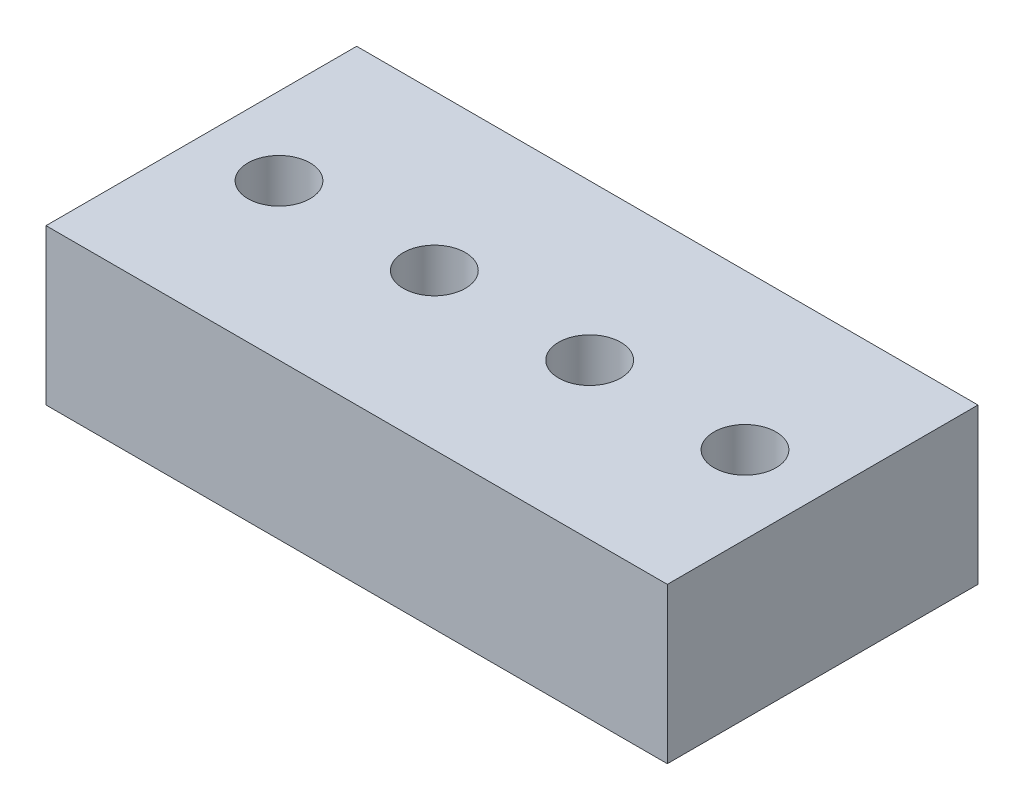
ISO-10303-21;
HEADER;
FILE_DESCRIPTION(('STEP AP214'),'2;1');
FILE_NAME('part.step','',(''),(''),'','','');
FILE_SCHEMA(('AUTOMOTIVE_DESIGN { 1 0 10303 214 1 1 1 1 }'));
ENDSEC;
DATA;
#1=APPLICATION_CONTEXT('core data for automotive mechanical design processes');
#2=APPLICATION_PROTOCOL_DEFINITION('international standard','automotive_design',2000,#1);
#3=PRODUCT_CONTEXT('',#1,'mechanical');
#4=PRODUCT('Part','Part','',(#3));
#5=PRODUCT_RELATED_PRODUCT_CATEGORY('part','',(#4));
#6=PRODUCT_DEFINITION_FORMATION('','',#4);
#7=PRODUCT_DEFINITION_CONTEXT('part definition',#1,'design');
#8=PRODUCT_DEFINITION('design','',#6,#7);
#9=PRODUCT_DEFINITION_SHAPE('','',#8);
#10=(LENGTH_UNIT() NAMED_UNIT(*) SI_UNIT(.MILLI.,.METRE.));
#11=(NAMED_UNIT(*) PLANE_ANGLE_UNIT() SI_UNIT($,.RADIAN.));
#12=(NAMED_UNIT(*) SI_UNIT($,.STERADIAN.) SOLID_ANGLE_UNIT());
#13=UNCERTAINTY_MEASURE_WITH_UNIT(LENGTH_MEASURE(1.E-05),#10,'distance_accuracy_value','');
#14=(GEOMETRIC_REPRESENTATION_CONTEXT(3) GLOBAL_UNCERTAINTY_ASSIGNED_CONTEXT((#13)) GLOBAL_UNIT_ASSIGNED_CONTEXT((#10,
#11,#12)) REPRESENTATION_CONTEXT('',''));
#15=CARTESIAN_POINT('',(0.,0.,0.));
#16=DIRECTION('',(0.,0.,1.));
#17=DIRECTION('',(1.,0.,0.));
#18=AXIS2_PLACEMENT_3D('',#15,#16,#17);
#19=CARTESIAN_POINT('',(30.,0.,0.));
#20=DIRECTION('',(0.,1.,0.));
#21=DIRECTION('',(0.,0.,1.));
#22=AXIS2_PLACEMENT_3D('',#19,#20,#21);
#23=CYLINDRICAL_SURFACE('',#22,3.99999999999999);
#24=CARTESIAN_POINT('',(30.,0.,0.));
#25=DIRECTION('',(0.,1.,0.));
#26=DIRECTION('',(0.,0.,1.));
#27=AXIS2_PLACEMENT_3D('',#24,#25,#26);
#28=CIRCLE('',#27,3.99999999999999);
#29=CARTESIAN_POINT('',(30.,0.,3.99999999999999));
#30=VERTEX_POINT('',#29);
#31=EDGE_CURVE('E49',#30,#30,#28,.T.);
#32=ORIENTED_EDGE('',*,*,#31,.F.);
#33=EDGE_LOOP('',(#32));
#34=FACE_BOUND('',#33,.T.);
#35=CARTESIAN_POINT('',(30.,20.,0.));
#36=DIRECTION('',(0.,1.,0.));
#37=DIRECTION('',(0.,0.,1.));
#38=AXIS2_PLACEMENT_3D('',#35,#36,#37);
#39=CIRCLE('',#38,3.99999999999999);
#40=CARTESIAN_POINT('',(30.,20.,3.99999999999999));
#41=VERTEX_POINT('',#40);
#42=EDGE_CURVE('E11',#41,#41,#39,.T.);
#43=ORIENTED_EDGE('',*,*,#42,.T.);
#44=EDGE_LOOP('',(#43));
#45=FACE_BOUND('',#44,.T.);
#46=ADVANCED_FACE('F41',(#34,#45),#23,.F.);
#47=CARTESIAN_POINT('',(10.,0.,0.));
#48=DIRECTION('',(0.,1.,0.));
#49=DIRECTION('',(0.,0.,1.));
#50=AXIS2_PLACEMENT_3D('',#47,#48,#49);
#51=CYLINDRICAL_SURFACE('',#50,3.99999999999999);
#52=CARTESIAN_POINT('',(10.,0.,0.));
#53=DIRECTION('',(0.,1.,0.));
#54=DIRECTION('',(0.,0.,1.));
#55=AXIS2_PLACEMENT_3D('',#52,#53,#54);
#56=CIRCLE('',#55,3.99999999999999);
#57=CARTESIAN_POINT('',(10.,0.,3.99999999999999));
#58=VERTEX_POINT('',#57);
#59=EDGE_CURVE('E119',#58,#58,#56,.T.);
#60=ORIENTED_EDGE('',*,*,#59,.F.);
#61=EDGE_LOOP('',(#60));
#62=FACE_BOUND('',#61,.T.);
#63=CARTESIAN_POINT('',(10.,20.,0.));
#64=DIRECTION('',(0.,1.,0.));
#65=DIRECTION('',(0.,0.,1.));
#66=AXIS2_PLACEMENT_3D('',#63,#64,#65);
#67=CIRCLE('',#66,3.99999999999999);
#68=CARTESIAN_POINT('',(10.,20.,3.99999999999999));
#69=VERTEX_POINT('',#68);
#70=EDGE_CURVE('E122',#69,#69,#67,.T.);
#71=ORIENTED_EDGE('',*,*,#70,.T.);
#72=EDGE_LOOP('',(#71));
#73=FACE_BOUND('',#72,.T.);
#74=ADVANCED_FACE('F131',(#62,#73),#51,.F.);
#75=CARTESIAN_POINT('',(-40.,20.,-20.));
#76=DIRECTION('',(1.,0.,0.));
#77=DIRECTION('',(0.,0.,-1.));
#78=AXIS2_PLACEMENT_3D('',#75,#76,#77);
#79=PLANE('',#78);
#80=DIRECTION('',(0.,0.,1.));
#81=VECTOR('',#80,1.);
#82=CARTESIAN_POINT('',(-40.,0.,-20.));
#83=LINE('',#82,#81);
#84=CARTESIAN_POINT('',(-40.,0.,-20.));
#85=VERTEX_POINT('',#84);
#86=CARTESIAN_POINT('',(-40.,0.,20.));
#87=VERTEX_POINT('',#86);
#88=EDGE_CURVE('E109',#85,#87,#83,.T.);
#89=ORIENTED_EDGE('',*,*,#88,.T.);
#90=DIRECTION('',(0.,-1.,0.));
#91=VECTOR('',#90,1.);
#92=CARTESIAN_POINT('',(-40.,20.,20.));
#93=LINE('',#92,#91);
#94=CARTESIAN_POINT('',(-40.,20.,20.));
#95=VERTEX_POINT('',#94);
#96=EDGE_CURVE('E100',#95,#87,#93,.T.);
#97=ORIENTED_EDGE('',*,*,#96,.F.);
#98=DIRECTION('',(0.,0.,1.));
#99=VECTOR('',#98,1.);
#100=CARTESIAN_POINT('',(-40.,20.,-20.));
#101=LINE('',#100,#99);
#102=CARTESIAN_POINT('',(-40.,20.,-20.));
#103=VERTEX_POINT('',#102);
#104=EDGE_CURVE('E94',#103,#95,#101,.T.);
#105=ORIENTED_EDGE('',*,*,#104,.F.);
#106=DIRECTION('',(0.,-1.,0.));
#107=VECTOR('',#106,1.);
#108=CARTESIAN_POINT('',(-40.,20.,-20.));
#109=LINE('',#108,#107);
#110=EDGE_CURVE('E105',#103,#85,#109,.T.);
#111=ORIENTED_EDGE('',*,*,#110,.T.);
#112=EDGE_LOOP('',(#89,#97,#105,#111));
#113=FACE_BOUND('',#112,.T.);
#114=ADVANCED_FACE('F156',(#113),#79,.F.);
#115=CARTESIAN_POINT('',(-40.,20.,20.));
#116=DIRECTION('',(0.,0.,-1.));
#117=DIRECTION('',(-1.,0.,0.));
#118=AXIS2_PLACEMENT_3D('',#115,#116,#117);
#119=PLANE('',#118);
#120=DIRECTION('',(1.,0.,0.));
#121=VECTOR('',#120,1.);
#122=CARTESIAN_POINT('',(-40.,0.,20.));
#123=LINE('',#122,#121);
#124=CARTESIAN_POINT('',(40.,0.,20.));
#125=VERTEX_POINT('',#124);
#126=EDGE_CURVE('E99',#87,#125,#123,.T.);
#127=ORIENTED_EDGE('',*,*,#126,.T.);
#128=DIRECTION('',(0.,-1.,0.));
#129=VECTOR('',#128,1.);
#130=CARTESIAN_POINT('',(40.,20.,20.));
#131=LINE('',#130,#129);
#132=CARTESIAN_POINT('',(40.,20.,20.));
#133=VERTEX_POINT('',#132);
#134=EDGE_CURVE('E97',#133,#125,#131,.T.);
#135=ORIENTED_EDGE('',*,*,#134,.F.);
#136=DIRECTION('',(1.,0.,0.));
#137=VECTOR('',#136,1.);
#138=CARTESIAN_POINT('',(-40.,20.,20.));
#139=LINE('',#138,#137);
#140=EDGE_CURVE('E88',#95,#133,#139,.T.);
#141=ORIENTED_EDGE('',*,*,#140,.F.);
#142=ORIENTED_EDGE('',*,*,#96,.T.);
#143=EDGE_LOOP('',(#127,#135,#141,#142));
#144=FACE_BOUND('',#143,.T.);
#145=ADVANCED_FACE('F98',(#144),#119,.F.);
#146=CARTESIAN_POINT('',(40.,20.,20.));
#147=DIRECTION('',(-1.,0.,0.));
#148=DIRECTION('',(0.,0.,1.));
#149=AXIS2_PLACEMENT_3D('',#146,#147,#148);
#150=PLANE('',#149);
#151=DIRECTION('',(0.,0.,-1.));
#152=VECTOR('',#151,1.);
#153=CARTESIAN_POINT('',(40.,0.,20.));
#154=LINE('',#153,#152);
#155=CARTESIAN_POINT('',(40.,0.,-20.));
#156=VERTEX_POINT('',#155);
#157=EDGE_CURVE('E74',#125,#156,#154,.T.);
#158=ORIENTED_EDGE('',*,*,#157,.T.);
#159=DIRECTION('',(0.,-1.,0.));
#160=VECTOR('',#159,1.);
#161=CARTESIAN_POINT('',(40.,20.,-20.));
#162=LINE('',#161,#160);
#163=CARTESIAN_POINT('',(40.,20.,-20.));
#164=VERTEX_POINT('',#163);
#165=EDGE_CURVE('E101',#164,#156,#162,.T.);
#166=ORIENTED_EDGE('',*,*,#165,.F.);
#167=DIRECTION('',(0.,0.,-1.));
#168=VECTOR('',#167,1.);
#169=CARTESIAN_POINT('',(40.,20.,20.));
#170=LINE('',#169,#168);
#171=EDGE_CURVE('E92',#133,#164,#170,.T.);
#172=ORIENTED_EDGE('',*,*,#171,.F.);
#173=ORIENTED_EDGE('',*,*,#134,.T.);
#174=EDGE_LOOP('',(#158,#166,#172,#173));
#175=FACE_BOUND('',#174,.T.);
#176=ADVANCED_FACE('F103',(#175),#150,.F.);
#177=CARTESIAN_POINT('',(40.,20.,-20.));
#178=DIRECTION('',(0.,0.,1.));
#179=DIRECTION('',(1.,0.,0.));
#180=AXIS2_PLACEMENT_3D('',#177,#178,#179);
#181=PLANE('',#180);
#182=DIRECTION('',(-1.,0.,0.));
#183=VECTOR('',#182,1.);
#184=CARTESIAN_POINT('',(40.,0.,-20.));
#185=LINE('',#184,#183);
#186=EDGE_CURVE('E80',#156,#85,#185,.T.);
#187=ORIENTED_EDGE('',*,*,#186,.T.);
#188=ORIENTED_EDGE('',*,*,#110,.F.);
#189=DIRECTION('',(-1.,0.,0.));
#190=VECTOR('',#189,1.);
#191=CARTESIAN_POINT('',(40.,20.,-20.));
#192=LINE('',#191,#190);
#193=EDGE_CURVE('E57',#164,#103,#192,.T.);
#194=ORIENTED_EDGE('',*,*,#193,.F.);
#195=ORIENTED_EDGE('',*,*,#165,.T.);
#196=EDGE_LOOP('',(#187,#188,#194,#195));
#197=FACE_BOUND('',#196,.T.);
#198=ADVANCED_FACE('F135',(#197),#181,.F.);
#199=CARTESIAN_POINT('',(0.,20.,0.));
#200=DIRECTION('',(0.,1.,0.));
#201=DIRECTION('',(0.,0.,1.));
#202=AXIS2_PLACEMENT_3D('',#199,#200,#201);
#203=PLANE('',#202);
#204=CARTESIAN_POINT('',(-10.,20.,0.));
#205=DIRECTION('',(0.,1.,0.));
#206=DIRECTION('',(0.,0.,1.));
#207=AXIS2_PLACEMENT_3D('',#204,#205,#206);
#208=CIRCLE('',#207,3.99999999999999);
#209=CARTESIAN_POINT('',(-10.,20.,3.99999999999999));
#210=VERTEX_POINT('',#209);
#211=EDGE_CURVE('E232',#210,#210,#208,.T.);
#212=ORIENTED_EDGE('',*,*,#211,.F.);
#213=EDGE_LOOP('',(#212));
#214=FACE_BOUND('',#213,.T.);
#215=CARTESIAN_POINT('',(-30.,20.,0.));
#216=DIRECTION('',(0.,1.,0.));
#217=DIRECTION('',(0.,0.,1.));
#218=AXIS2_PLACEMENT_3D('',#215,#216,#217);
#219=CIRCLE('',#218,3.99999999999999);
#220=CARTESIAN_POINT('',(-30.,20.,3.99999999999999));
#221=VERTEX_POINT('',#220);
#222=EDGE_CURVE('E233',#221,#221,#219,.T.);
#223=ORIENTED_EDGE('',*,*,#222,.F.);
#224=EDGE_LOOP('',(#223));
#225=FACE_BOUND('',#224,.T.);
#226=ORIENTED_EDGE('',*,*,#104,.T.);
#227=ORIENTED_EDGE('',*,*,#140,.T.);
#228=ORIENTED_EDGE('',*,*,#171,.T.);
#229=ORIENTED_EDGE('',*,*,#193,.T.);
#230=EDGE_LOOP('',(#226,#227,#228,#229));
#231=FACE_BOUND('',#230,.T.);
#232=ORIENTED_EDGE('',*,*,#70,.F.);
#233=EDGE_LOOP('',(#232));
#234=FACE_BOUND('',#233,.T.);
#235=ORIENTED_EDGE('',*,*,#42,.F.);
#236=EDGE_LOOP('',(#235));
#237=FACE_BOUND('',#236,.T.);
#238=ADVANCED_FACE('F89',(#214,#225,#231,#234,#237),#203,.T.);
#239=CARTESIAN_POINT('',(0.,0.,0.));
#240=DIRECTION('',(0.,1.,0.));
#241=DIRECTION('',(0.,0.,1.));
#242=AXIS2_PLACEMENT_3D('',#239,#240,#241);
#243=PLANE('',#242);
#244=CARTESIAN_POINT('',(-10.,0.,0.));
#245=DIRECTION('',(0.,1.,0.));
#246=DIRECTION('',(0.,0.,1.));
#247=AXIS2_PLACEMENT_3D('',#244,#245,#246);
#248=CIRCLE('',#247,3.99999999999999);
#249=CARTESIAN_POINT('',(-10.,0.,3.99999999999999));
#250=VERTEX_POINT('',#249);
#251=EDGE_CURVE('E230',#250,#250,#248,.T.);
#252=ORIENTED_EDGE('',*,*,#251,.T.);
#253=EDGE_LOOP('',(#252));
#254=FACE_BOUND('',#253,.T.);
#255=CARTESIAN_POINT('',(-30.,0.,0.));
#256=DIRECTION('',(0.,1.,0.));
#257=DIRECTION('',(0.,0.,1.));
#258=AXIS2_PLACEMENT_3D('',#255,#256,#257);
#259=CIRCLE('',#258,3.99999999999999);
#260=CARTESIAN_POINT('',(-30.,0.,3.99999999999999));
#261=VERTEX_POINT('',#260);
#262=EDGE_CURVE('E112',#261,#261,#259,.T.);
#263=ORIENTED_EDGE('',*,*,#262,.T.);
#264=EDGE_LOOP('',(#263));
#265=FACE_BOUND('',#264,.T.);
#266=ORIENTED_EDGE('',*,*,#88,.F.);
#267=ORIENTED_EDGE('',*,*,#186,.F.);
#268=ORIENTED_EDGE('',*,*,#157,.F.);
#269=ORIENTED_EDGE('',*,*,#126,.F.);
#270=EDGE_LOOP('',(#266,#267,#268,#269));
#271=FACE_BOUND('',#270,.T.);
#272=ORIENTED_EDGE('',*,*,#59,.T.);
#273=EDGE_LOOP('',(#272));
#274=FACE_BOUND('',#273,.T.);
#275=ORIENTED_EDGE('',*,*,#31,.T.);
#276=EDGE_LOOP('',(#275));
#277=FACE_BOUND('',#276,.T.);
#278=ADVANCED_FACE('F127',(#254,#265,#271,#274,#277),#243,.F.);
#279=CARTESIAN_POINT('',(-30.,0.,0.));
#280=DIRECTION('',(0.,1.,0.));
#281=DIRECTION('',(0.,0.,1.));
#282=AXIS2_PLACEMENT_3D('',#279,#280,#281);
#283=CYLINDRICAL_SURFACE('',#282,3.99999999999999);
#284=ORIENTED_EDGE('',*,*,#262,.F.);
#285=EDGE_LOOP('',(#284));
#286=FACE_BOUND('',#285,.T.);
#287=ORIENTED_EDGE('',*,*,#222,.T.);
#288=EDGE_LOOP('',(#287));
#289=FACE_BOUND('',#288,.T.);
#290=ADVANCED_FACE('F142',(#286,#289),#283,.F.);
#291=CARTESIAN_POINT('',(-10.,0.,0.));
#292=DIRECTION('',(0.,1.,0.));
#293=DIRECTION('',(0.,0.,1.));
#294=AXIS2_PLACEMENT_3D('',#291,#292,#293);
#295=CYLINDRICAL_SURFACE('',#294,3.99999999999999);
#296=ORIENTED_EDGE('',*,*,#251,.F.);
#297=EDGE_LOOP('',(#296));
#298=FACE_BOUND('',#297,.T.);
#299=ORIENTED_EDGE('',*,*,#211,.T.);
#300=EDGE_LOOP('',(#299));
#301=FACE_BOUND('',#300,.T.);
#302=ADVANCED_FACE('F178',(#298,#301),#295,.F.);
#303=CLOSED_SHELL('',(#46,#74,#114,#145,#176,#198,#238,#278,#290,#302));
#304=MANIFOLD_SOLID_BREP('B2',#303);
#305=ADVANCED_BREP_SHAPE_REPRESENTATION('',(#18,#304),#14);
#306=SHAPE_DEFINITION_REPRESENTATION(#9,#305);
ENDSEC;
END-ISO-10303-21;
